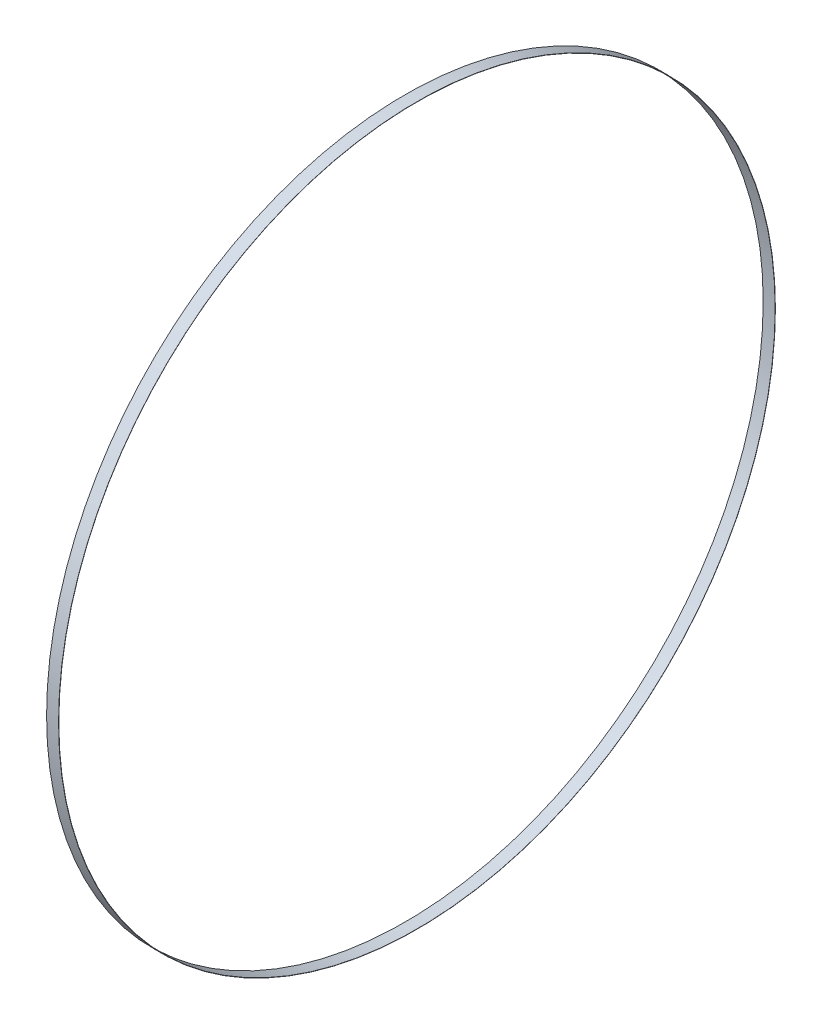
ISO-10303-21;
HEADER;
FILE_DESCRIPTION(('STEP AP214'),'2;1');
FILE_NAME('part.step','',(''),(''),'','','');
FILE_SCHEMA(('AUTOMOTIVE_DESIGN { 1 0 10303 214 1 1 1 1 }'));
ENDSEC;
DATA;
#1=APPLICATION_CONTEXT('core data for automotive mechanical design processes');
#2=APPLICATION_PROTOCOL_DEFINITION('international standard','automotive_design',2000,#1);
#3=PRODUCT_CONTEXT('',#1,'mechanical');
#4=PRODUCT('Part','Part','',(#3));
#5=PRODUCT_RELATED_PRODUCT_CATEGORY('part','',(#4));
#6=PRODUCT_DEFINITION_FORMATION('','',#4);
#7=PRODUCT_DEFINITION_CONTEXT('part definition',#1,'design');
#8=PRODUCT_DEFINITION('design','',#6,#7);
#9=PRODUCT_DEFINITION_SHAPE('','',#8);
#10=(LENGTH_UNIT() NAMED_UNIT(*) SI_UNIT(.MILLI.,.METRE.));
#11=(NAMED_UNIT(*) PLANE_ANGLE_UNIT() SI_UNIT($,.RADIAN.));
#12=(NAMED_UNIT(*) SI_UNIT($,.STERADIAN.) SOLID_ANGLE_UNIT());
#13=UNCERTAINTY_MEASURE_WITH_UNIT(LENGTH_MEASURE(1.E-05),#10,'distance_accuracy_value','');
#14=(GEOMETRIC_REPRESENTATION_CONTEXT(3) GLOBAL_UNCERTAINTY_ASSIGNED_CONTEXT((#13)) GLOBAL_UNIT_ASSIGNED_CONTEXT((#10,
#11,#12)) REPRESENTATION_CONTEXT('',''));
#15=CARTESIAN_POINT('',(0.,0.,0.));
#16=DIRECTION('',(0.,0.,1.));
#17=DIRECTION('',(1.,0.,0.));
#18=AXIS2_PLACEMENT_3D('',#15,#16,#17);
#19=CARTESIAN_POINT('',(0.,-1494.5,0.));
#20=DIRECTION('',(-1.,0.,0.));
#21=DIRECTION('',(0.,0.,1.));
#22=AXIS2_PLACEMENT_3D('',#19,#20,#21);
#23=PLANE('',#22);
#24=CARTESIAN_POINT('',(0.,0.,0.));
#25=DIRECTION('',(-1.,0.,0.));
#26=DIRECTION('',(0.,0.,1.));
#27=AXIS2_PLACEMENT_3D('',#24,#25,#26);
#28=CIRCLE('',#27,1495.5);
#29=CARTESIAN_POINT('',(0.,0.,1495.5));
#30=VERTEX_POINT('',#29);
#31=EDGE_CURVE('E10',#30,#30,#28,.T.);
#32=ORIENTED_EDGE('',*,*,#31,.T.);
#33=EDGE_LOOP('',(#32));
#34=FACE_BOUND('',#33,.T.);
#35=CARTESIAN_POINT('',(0.,0.,0.));
#36=DIRECTION('',(-1.,0.,0.));
#37=DIRECTION('',(0.,0.,1.));
#38=AXIS2_PLACEMENT_3D('',#35,#36,#37);
#39=CIRCLE('',#38,1494.5);
#40=CARTESIAN_POINT('',(0.,0.,1494.5));
#41=VERTEX_POINT('',#40);
#42=EDGE_CURVE('E50',#41,#41,#39,.T.);
#43=ORIENTED_EDGE('',*,*,#42,.F.);
#44=EDGE_LOOP('',(#43));
#45=FACE_BOUND('',#44,.T.);
#46=ADVANCED_FACE('F36',(#34,#45),#23,.T.);
#47=CARTESIAN_POINT('',(0.,0.,0.));
#48=DIRECTION('',(-1.,0.,0.));
#49=DIRECTION('',(0.,0.,1.));
#50=AXIS2_PLACEMENT_3D('',#47,#48,#49);
#51=CYLINDRICAL_SURFACE('',#50,1495.5);
#52=CARTESIAN_POINT('',(49.9999999999994,0.,0.));
#53=DIRECTION('',(-1.,0.,0.));
#54=DIRECTION('',(0.,0.,1.));
#55=AXIS2_PLACEMENT_3D('',#52,#53,#54);
#56=CIRCLE('',#55,1495.5);
#57=CARTESIAN_POINT('',(49.9999999999994,0.,1495.5));
#58=VERTEX_POINT('',#57);
#59=EDGE_CURVE('E42',#58,#58,#56,.T.);
#60=ORIENTED_EDGE('',*,*,#59,.T.);
#61=EDGE_LOOP('',(#60));
#62=FACE_BOUND('',#61,.T.);
#63=ORIENTED_EDGE('',*,*,#31,.F.);
#64=EDGE_LOOP('',(#63));
#65=FACE_BOUND('',#64,.T.);
#66=ADVANCED_FACE('F60',(#62,#65),#51,.T.);
#67=CARTESIAN_POINT('',(49.9999999999997,-1494.5,0.));
#68=DIRECTION('',(1.,0.,0.));
#69=DIRECTION('',(0.,0.,-1.));
#70=AXIS2_PLACEMENT_3D('',#67,#68,#69);
#71=PLANE('',#70);
#72=CARTESIAN_POINT('',(50.0000000000001,0.,0.));
#73=DIRECTION('',(-1.,0.,0.));
#74=DIRECTION('',(0.,0.,1.));
#75=AXIS2_PLACEMENT_3D('',#72,#73,#74);
#76=CIRCLE('',#75,1494.5);
#77=CARTESIAN_POINT('',(50.0000000000001,0.,1494.5));
#78=VERTEX_POINT('',#77);
#79=EDGE_CURVE('E46',#78,#78,#76,.T.);
#80=ORIENTED_EDGE('',*,*,#79,.T.);
#81=EDGE_LOOP('',(#80));
#82=FACE_BOUND('',#81,.T.);
#83=ORIENTED_EDGE('',*,*,#59,.F.);
#84=EDGE_LOOP('',(#83));
#85=FACE_BOUND('',#84,.T.);
#86=ADVANCED_FACE('F64',(#82,#85),#71,.T.);
#87=CARTESIAN_POINT('',(0.,0.,0.));
#88=DIRECTION('',(-1.,0.,0.));
#89=DIRECTION('',(0.,0.,1.));
#90=AXIS2_PLACEMENT_3D('',#87,#88,#89);
#91=CYLINDRICAL_SURFACE('',#90,1494.5);
#92=ORIENTED_EDGE('',*,*,#42,.T.);
#93=EDGE_LOOP('',(#92));
#94=FACE_BOUND('',#93,.T.);
#95=ORIENTED_EDGE('',*,*,#79,.F.);
#96=EDGE_LOOP('',(#95));
#97=FACE_BOUND('',#96,.T.);
#98=ADVANCED_FACE('F56',(#94,#97),#91,.F.);
#99=CLOSED_SHELL('',(#46,#66,#86,#98));
#100=MANIFOLD_SOLID_BREP('B2',#99);
#101=ADVANCED_BREP_SHAPE_REPRESENTATION('',(#18,#100),#14);
#102=SHAPE_DEFINITION_REPRESENTATION(#9,#101);
ENDSEC;
END-ISO-10303-21;
